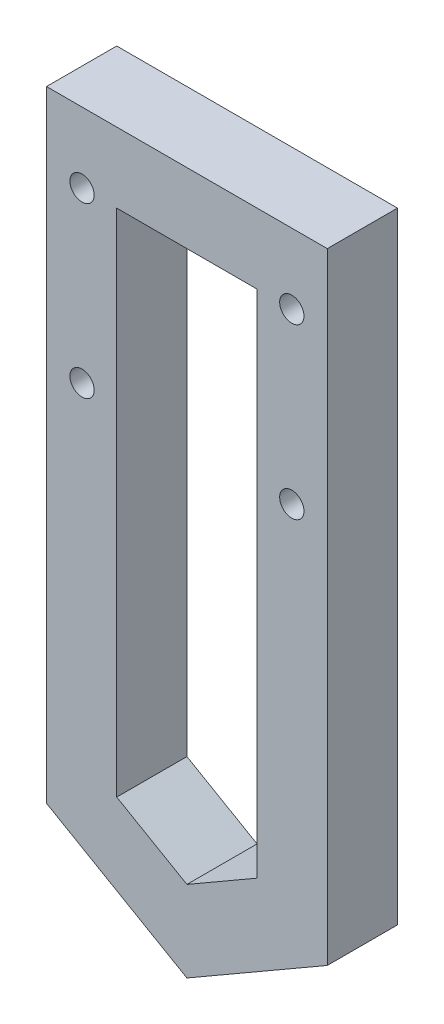
ISO-10303-21;
HEADER;
FILE_DESCRIPTION(('STEP AP214'),'2;1');
FILE_NAME('part.step','',(''),(''),'','','');
FILE_SCHEMA(('AUTOMOTIVE_DESIGN { 1 0 10303 214 1 1 1 1 }'));
ENDSEC;
DATA;
#1=APPLICATION_CONTEXT('core data for automotive mechanical design processes');
#2=APPLICATION_PROTOCOL_DEFINITION('international standard','automotive_design',2000,#1);
#3=PRODUCT_CONTEXT('',#1,'mechanical');
#4=PRODUCT('Part','Part','',(#3));
#5=PRODUCT_RELATED_PRODUCT_CATEGORY('part','',(#4));
#6=PRODUCT_DEFINITION_FORMATION('','',#4);
#7=PRODUCT_DEFINITION_CONTEXT('part definition',#1,'design');
#8=PRODUCT_DEFINITION('design','',#6,#7);
#9=PRODUCT_DEFINITION_SHAPE('','',#8);
#10=(LENGTH_UNIT() NAMED_UNIT(*) SI_UNIT(.MILLI.,.METRE.));
#11=(NAMED_UNIT(*) PLANE_ANGLE_UNIT() SI_UNIT($,.RADIAN.));
#12=(NAMED_UNIT(*) SI_UNIT($,.STERADIAN.) SOLID_ANGLE_UNIT());
#13=UNCERTAINTY_MEASURE_WITH_UNIT(LENGTH_MEASURE(1.E-05),#10,'distance_accuracy_value','');
#14=(GEOMETRIC_REPRESENTATION_CONTEXT(3) GLOBAL_UNCERTAINTY_ASSIGNED_CONTEXT((#13)) GLOBAL_UNIT_ASSIGNED_CONTEXT((#10,
#11,#12)) REPRESENTATION_CONTEXT('',''));
#15=CARTESIAN_POINT('',(0.,0.,0.));
#16=DIRECTION('',(0.,0.,1.));
#17=DIRECTION('',(1.,0.,0.));
#18=AXIS2_PLACEMENT_3D('',#15,#16,#17);
#19=CARTESIAN_POINT('',(0.,0.,10.));
#20=DIRECTION('',(0.,0.,1.));
#21=DIRECTION('',(1.,0.,0.));
#22=AXIS2_PLACEMENT_3D('',#19,#20,#21);
#23=PLANE('',#22);
#24=CARTESIAN_POINT('',(-17.8523682514523,228.318722846225,10.));
#25=DIRECTION('',(0.,0.,1.));
#26=DIRECTION('',(1.,0.,0.));
#27=AXIS2_PLACEMENT_3D('',#24,#25,#26);
#28=CIRCLE('',#27,1.73);
#29=CARTESIAN_POINT('',(-16.1223682514523,228.318722846225,10.));
#30=VERTEX_POINT('',#29);
#31=EDGE_CURVE('E285',#30,#30,#28,.F.);
#32=ORIENTED_EDGE('',*,*,#31,.T.);
#33=EDGE_LOOP('',(#32));
#34=FACE_BOUND('',#33,.T.);
#35=CARTESIAN_POINT('',(-17.8523682514523,204.258722846225,10.));
#36=DIRECTION('',(0.,0.,1.));
#37=DIRECTION('',(1.,0.,0.));
#38=AXIS2_PLACEMENT_3D('',#35,#36,#37);
#39=CIRCLE('',#38,1.73);
#40=CARTESIAN_POINT('',(-16.1223682514523,204.258722846225,10.));
#41=VERTEX_POINT('',#40);
#42=EDGE_CURVE('E281',#41,#41,#39,.F.);
#43=ORIENTED_EDGE('',*,*,#42,.T.);
#44=EDGE_LOOP('',(#43));
#45=FACE_BOUND('',#44,.T.);
#46=DIRECTION('',(0.866025403784439,-0.5,0.));
#47=VECTOR('',#46,1.);
#48=CARTESIAN_POINT('',(51.6944218390617,89.537365093153,10.));
#49=LINE('',#48,#47);
#50=CARTESIAN_POINT('',(-52.7973682514523,149.865728230017,10.));
#51=VERTEX_POINT('',#50);
#52=CARTESIAN_POINT('',(-32.7973682514523,138.318722846225,10.));
#53=VERTEX_POINT('',#52);
#54=EDGE_CURVE('E107',#51,#53,#49,.T.);
#55=ORIENTED_EDGE('',*,*,#54,.T.);
#56=DIRECTION('',(-0.866025403784439,-0.499999999999999,0.));
#57=VECTOR('',#56,1.);
#58=CARTESIAN_POINT('',(-68.0931059647878,117.940719176184,10.));
#59=LINE('',#58,#57);
#60=CARTESIAN_POINT('',(-12.7973682514524,149.865728230017,10.));
#61=VERTEX_POINT('',#60);
#62=EDGE_CURVE('E199',#61,#53,#59,.T.);
#63=ORIENTED_EDGE('',*,*,#62,.F.);
#64=DIRECTION('',(0.,1.,0.));
#65=VECTOR('',#64,1.);
#66=CARTESIAN_POINT('',(-12.7973682514524,0.,10.));
#67=LINE('',#66,#65);
#68=CARTESIAN_POINT('',(-12.7973682514524,238.318722846225,10.));
#69=VERTEX_POINT('',#68);
#70=EDGE_CURVE('E210',#61,#69,#67,.T.);
#71=ORIENTED_EDGE('',*,*,#70,.T.);
#72=DIRECTION('',(1.,0.,0.));
#73=VECTOR('',#72,1.);
#74=CARTESIAN_POINT('',(0.,238.318722846225,10.));
#75=LINE('',#74,#73);
#76=CARTESIAN_POINT('',(-52.7973682514523,238.318722846225,10.));
#77=VERTEX_POINT('',#76);
#78=EDGE_CURVE('E213',#77,#69,#75,.T.);
#79=ORIENTED_EDGE('',*,*,#78,.F.);
#80=DIRECTION('',(0.,1.,0.));
#81=VECTOR('',#80,1.);
#82=CARTESIAN_POINT('',(-52.7973682514523,0.,10.));
#83=LINE('',#82,#81);
#84=EDGE_CURVE('E216',#51,#77,#83,.T.);
#85=ORIENTED_EDGE('',*,*,#84,.F.);
#86=EDGE_LOOP('',(#55,#63,#71,#79,#85));
#87=FACE_BOUND('',#86,.T.);
#88=DIRECTION('',(-1.,0.,0.));
#89=VECTOR('',#88,1.);
#90=CARTESIAN_POINT('',(0.,228.318722846225,10.));
#91=LINE('',#90,#89);
#92=CARTESIAN_POINT('',(-22.7973682514524,228.318722846225,10.));
#93=VERTEX_POINT('',#92);
#94=CARTESIAN_POINT('',(-42.7973682514523,228.318722846225,10.));
#95=VERTEX_POINT('',#94);
#96=EDGE_CURVE('E218',#93,#95,#91,.T.);
#97=ORIENTED_EDGE('',*,*,#96,.F.);
#98=DIRECTION('',(0.,1.,0.));
#99=VECTOR('',#98,1.);
#100=CARTESIAN_POINT('',(-22.7973682514524,0.,10.));
#101=LINE('',#100,#99);
#102=CARTESIAN_POINT('',(-22.7973682514524,155.639230921913,10.));
#103=VERTEX_POINT('',#102);
#104=EDGE_CURVE('E148',#103,#93,#101,.T.);
#105=ORIENTED_EDGE('',*,*,#104,.F.);
#106=DIRECTION('',(0.866025403784438,0.500000000000002,0.));
#107=VECTOR('',#106,1.);
#108=CARTESIAN_POINT('',(-73.0931059647881,126.600973214028,10.));
#109=LINE('',#108,#107);
#110=CARTESIAN_POINT('',(-32.7973682514523,149.865728230017,10.));
#111=VERTEX_POINT('',#110);
#112=EDGE_CURVE('E133',#111,#103,#109,.T.);
#113=ORIENTED_EDGE('',*,*,#112,.F.);
#114=DIRECTION('',(0.866025403784442,-0.499999999999995,0.));
#115=VECTOR('',#114,1.);
#116=CARTESIAN_POINT('',(56.6944218390614,98.1976191309982,10.));
#117=LINE('',#116,#115);
#118=CARTESIAN_POINT('',(-42.7973682514523,155.639230921913,10.));
#119=VERTEX_POINT('',#118);
#120=EDGE_CURVE('E146',#119,#111,#117,.T.);
#121=ORIENTED_EDGE('',*,*,#120,.F.);
#122=DIRECTION('',(0.,-1.,0.));
#123=VECTOR('',#122,1.);
#124=CARTESIAN_POINT('',(-42.7973682514523,0.,10.));
#125=LINE('',#124,#123);
#126=EDGE_CURVE('E151',#95,#119,#125,.T.);
#127=ORIENTED_EDGE('',*,*,#126,.F.);
#128=EDGE_LOOP('',(#97,#105,#113,#121,#127));
#129=FACE_BOUND('',#128,.T.);
#130=CARTESIAN_POINT('',(-47.7423682514523,228.318722846225,10.));
#131=DIRECTION('',(0.,0.,1.));
#132=DIRECTION('',(1.,0.,0.));
#133=AXIS2_PLACEMENT_3D('',#130,#131,#132);
#134=CIRCLE('',#133,1.73);
#135=CARTESIAN_POINT('',(-46.0123682514523,228.318722846225,10.));
#136=VERTEX_POINT('',#135);
#137=EDGE_CURVE('E270',#136,#136,#134,.T.);
#138=ORIENTED_EDGE('',*,*,#137,.F.);
#139=EDGE_LOOP('',(#138));
#140=FACE_BOUND('',#139,.T.);
#141=CARTESIAN_POINT('',(-47.7423682514523,204.258722846225,10.));
#142=DIRECTION('',(0.,0.,1.));
#143=DIRECTION('',(1.,0.,0.));
#144=AXIS2_PLACEMENT_3D('',#141,#142,#143);
#145=CIRCLE('',#144,1.73);
#146=CARTESIAN_POINT('',(-46.0123682514523,204.258722846225,10.));
#147=VERTEX_POINT('',#146);
#148=EDGE_CURVE('E278',#147,#147,#145,.T.);
#149=ORIENTED_EDGE('',*,*,#148,.F.);
#150=EDGE_LOOP('',(#149));
#151=FACE_BOUND('',#150,.T.);
#152=ADVANCED_FACE('F44',(#34,#45,#87,#129,#140,#151),#23,.T.);
#153=CARTESIAN_POINT('',(0.,0.,0.));
#154=DIRECTION('',(0.,0.,1.));
#155=DIRECTION('',(1.,0.,0.));
#156=AXIS2_PLACEMENT_3D('',#153,#154,#155);
#157=PLANE('',#156);
#158=CARTESIAN_POINT('',(-47.7423682514523,228.318722846225,0.));
#159=DIRECTION('',(0.,0.,1.));
#160=DIRECTION('',(1.,0.,0.));
#161=AXIS2_PLACEMENT_3D('',#158,#159,#160);
#162=CIRCLE('',#161,1.73);
#163=CARTESIAN_POINT('',(-46.0123682514523,228.318722846225,0.));
#164=VERTEX_POINT('',#163);
#165=EDGE_CURVE('E273',#164,#164,#162,.T.);
#166=ORIENTED_EDGE('',*,*,#165,.T.);
#167=EDGE_LOOP('',(#166));
#168=FACE_BOUND('',#167,.T.);
#169=CARTESIAN_POINT('',(-17.8523682514523,204.258722846225,0.));
#170=DIRECTION('',(0.,0.,1.));
#171=DIRECTION('',(1.,0.,0.));
#172=AXIS2_PLACEMENT_3D('',#169,#170,#171);
#173=CIRCLE('',#172,1.73);
#174=CARTESIAN_POINT('',(-16.1223682514523,204.258722846225,0.));
#175=VERTEX_POINT('',#174);
#176=EDGE_CURVE('E161',#175,#175,#173,.F.);
#177=ORIENTED_EDGE('',*,*,#176,.F.);
#178=EDGE_LOOP('',(#177));
#179=FACE_BOUND('',#178,.T.);
#180=DIRECTION('',(0.866025403784439,-0.5,0.));
#181=VECTOR('',#180,1.);
#182=CARTESIAN_POINT('',(51.6944218390617,89.537365093153,0.));
#183=LINE('',#182,#181);
#184=CARTESIAN_POINT('',(-52.7973682514523,149.865728230017,0.));
#185=VERTEX_POINT('',#184);
#186=CARTESIAN_POINT('',(-32.7973682514523,138.318722846225,0.));
#187=VERTEX_POINT('',#186);
#188=EDGE_CURVE('E157',#185,#187,#183,.T.);
#189=ORIENTED_EDGE('',*,*,#188,.F.);
#190=DIRECTION('',(0.,1.,0.));
#191=VECTOR('',#190,1.);
#192=CARTESIAN_POINT('',(-52.7973682514523,0.,0.));
#193=LINE('',#192,#191);
#194=CARTESIAN_POINT('',(-52.7973682514523,238.318722846225,0.));
#195=VERTEX_POINT('',#194);
#196=EDGE_CURVE('E170',#185,#195,#193,.T.);
#197=ORIENTED_EDGE('',*,*,#196,.T.);
#198=DIRECTION('',(1.,0.,0.));
#199=VECTOR('',#198,1.);
#200=CARTESIAN_POINT('',(0.,238.318722846225,0.));
#201=LINE('',#200,#199);
#202=CARTESIAN_POINT('',(-12.7973682514524,238.318722846225,0.));
#203=VERTEX_POINT('',#202);
#204=EDGE_CURVE('E167',#195,#203,#201,.T.);
#205=ORIENTED_EDGE('',*,*,#204,.T.);
#206=DIRECTION('',(0.,1.,0.));
#207=VECTOR('',#206,1.);
#208=CARTESIAN_POINT('',(-12.7973682514524,0.,0.));
#209=LINE('',#208,#207);
#210=CARTESIAN_POINT('',(-12.7973682514524,149.865728230017,0.));
#211=VERTEX_POINT('',#210);
#212=EDGE_CURVE('E164',#211,#203,#209,.T.);
#213=ORIENTED_EDGE('',*,*,#212,.F.);
#214=DIRECTION('',(-0.866025403784439,-0.499999999999999,0.));
#215=VECTOR('',#214,1.);
#216=CARTESIAN_POINT('',(-68.0931059647878,117.940719176184,0.));
#217=LINE('',#216,#215);
#218=EDGE_CURVE('E160',#211,#187,#217,.T.);
#219=ORIENTED_EDGE('',*,*,#218,.T.);
#220=EDGE_LOOP('',(#189,#197,#205,#213,#219));
#221=FACE_BOUND('',#220,.T.);
#222=DIRECTION('',(-1.,0.,0.));
#223=VECTOR('',#222,1.);
#224=CARTESIAN_POINT('',(0.,228.318722846225,0.));
#225=LINE('',#224,#223);
#226=CARTESIAN_POINT('',(-22.7973682514524,228.318722846225,0.));
#227=VERTEX_POINT('',#226);
#228=CARTESIAN_POINT('',(-42.7973682514523,228.318722846225,0.));
#229=VERTEX_POINT('',#228);
#230=EDGE_CURVE('E173',#227,#229,#225,.T.);
#231=ORIENTED_EDGE('',*,*,#230,.T.);
#232=DIRECTION('',(0.,-1.,0.));
#233=VECTOR('',#232,1.);
#234=CARTESIAN_POINT('',(-42.7973682514523,0.,0.));
#235=LINE('',#234,#233);
#236=CARTESIAN_POINT('',(-42.7973682514523,155.639230921913,0.));
#237=VERTEX_POINT('',#236);
#238=EDGE_CURVE('E181',#229,#237,#235,.T.);
#239=ORIENTED_EDGE('',*,*,#238,.T.);
#240=DIRECTION('',(0.866025403784442,-0.499999999999995,0.));
#241=VECTOR('',#240,1.);
#242=CARTESIAN_POINT('',(56.6944218390614,98.1976191309982,0.));
#243=LINE('',#242,#241);
#244=CARTESIAN_POINT('',(-32.7973682514523,149.865728230017,0.));
#245=VERTEX_POINT('',#244);
#246=EDGE_CURVE('E179',#237,#245,#243,.T.);
#247=ORIENTED_EDGE('',*,*,#246,.T.);
#248=DIRECTION('',(0.866025403784438,0.500000000000002,0.));
#249=VECTOR('',#248,1.);
#250=CARTESIAN_POINT('',(-73.0931059647881,126.600973214028,0.));
#251=LINE('',#250,#249);
#252=CARTESIAN_POINT('',(-22.7973682514524,155.639230921913,0.));
#253=VERTEX_POINT('',#252);
#254=EDGE_CURVE('E135',#245,#253,#251,.T.);
#255=ORIENTED_EDGE('',*,*,#254,.T.);
#256=DIRECTION('',(0.,1.,0.));
#257=VECTOR('',#256,1.);
#258=CARTESIAN_POINT('',(-22.7973682514524,0.,0.));
#259=LINE('',#258,#257);
#260=EDGE_CURVE('E175',#253,#227,#259,.T.);
#261=ORIENTED_EDGE('',*,*,#260,.T.);
#262=EDGE_LOOP('',(#231,#239,#247,#255,#261));
#263=FACE_BOUND('',#262,.T.);
#264=CARTESIAN_POINT('',(-17.8523682514523,228.318722846225,0.));
#265=DIRECTION('',(0.,0.,1.));
#266=DIRECTION('',(1.,0.,0.));
#267=AXIS2_PLACEMENT_3D('',#264,#265,#266);
#268=CIRCLE('',#267,1.73);
#269=CARTESIAN_POINT('',(-16.1223682514523,228.318722846225,0.));
#270=VERTEX_POINT('',#269);
#271=EDGE_CURVE('E275',#270,#270,#268,.F.);
#272=ORIENTED_EDGE('',*,*,#271,.F.);
#273=EDGE_LOOP('',(#272));
#274=FACE_BOUND('',#273,.T.);
#275=CARTESIAN_POINT('',(-47.7423682514523,204.258722846225,0.));
#276=DIRECTION('',(0.,0.,1.));
#277=DIRECTION('',(1.,0.,0.));
#278=AXIS2_PLACEMENT_3D('',#275,#276,#277);
#279=CIRCLE('',#278,1.73);
#280=CARTESIAN_POINT('',(-46.0123682514523,204.258722846225,0.));
#281=VERTEX_POINT('',#280);
#282=EDGE_CURVE('E282',#281,#281,#279,.T.);
#283=ORIENTED_EDGE('',*,*,#282,.T.);
#284=EDGE_LOOP('',(#283));
#285=FACE_BOUND('',#284,.T.);
#286=ADVANCED_FACE('F204',(#168,#179,#221,#263,#274,#285),#157,.F.);
#287=CARTESIAN_POINT('',(0.,228.318722846225,10.));
#288=DIRECTION('',(0.,-1.,0.));
#289=DIRECTION('',(0.,0.,-1.));
#290=AXIS2_PLACEMENT_3D('',#287,#288,#289);
#291=PLANE('',#290);
#292=ORIENTED_EDGE('',*,*,#230,.F.);
#293=DIRECTION('',(0.,0.,-1.));
#294=VECTOR('',#293,1.);
#295=CARTESIAN_POINT('',(-22.7973682514524,228.318722846225,10.));
#296=LINE('',#295,#294);
#297=EDGE_CURVE('E12',#93,#227,#296,.T.);
#298=ORIENTED_EDGE('',*,*,#297,.F.);
#299=ORIENTED_EDGE('',*,*,#96,.T.);
#300=DIRECTION('',(0.,0.,-1.));
#301=VECTOR('',#300,1.);
#302=CARTESIAN_POINT('',(-42.7973682514523,228.318722846225,10.));
#303=LINE('',#302,#301);
#304=EDGE_CURVE('E63',#95,#229,#303,.T.);
#305=ORIENTED_EDGE('',*,*,#304,.T.);
#306=EDGE_LOOP('',(#292,#298,#299,#305));
#307=FACE_BOUND('',#306,.T.);
#308=ADVANCED_FACE('F250',(#307),#291,.T.);
#309=CARTESIAN_POINT('',(-22.7973682514524,0.,10.));
#310=DIRECTION('',(-1.,0.,0.));
#311=DIRECTION('',(0.,0.,1.));
#312=AXIS2_PLACEMENT_3D('',#309,#310,#311);
#313=PLANE('',#312);
#314=ORIENTED_EDGE('',*,*,#260,.F.);
#315=DIRECTION('',(0.,0.,-1.));
#316=VECTOR('',#315,1.);
#317=CARTESIAN_POINT('',(-22.7973682514524,155.639230921913,10.));
#318=LINE('',#317,#316);
#319=EDGE_CURVE('E54',#103,#253,#318,.T.);
#320=ORIENTED_EDGE('',*,*,#319,.F.);
#321=ORIENTED_EDGE('',*,*,#104,.T.);
#322=ORIENTED_EDGE('',*,*,#297,.T.);
#323=EDGE_LOOP('',(#314,#320,#321,#322));
#324=FACE_BOUND('',#323,.T.);
#325=ADVANCED_FACE('F225',(#324),#313,.T.);
#326=CARTESIAN_POINT('',(-73.0931059647881,126.600973214028,10.));
#327=DIRECTION('',(-0.500000000000002,0.866025403784438,0.));
#328=DIRECTION('',(-0.866025403784438,-0.500000000000002,0.));
#329=AXIS2_PLACEMENT_3D('',#326,#327,#328);
#330=PLANE('',#329);
#331=ORIENTED_EDGE('',*,*,#254,.F.);
#332=DIRECTION('',(0.,0.,-1.));
#333=VECTOR('',#332,1.);
#334=CARTESIAN_POINT('',(-32.7973682514523,149.865728230017,10.));
#335=LINE('',#334,#333);
#336=EDGE_CURVE('E130',#111,#245,#335,.T.);
#337=ORIENTED_EDGE('',*,*,#336,.F.);
#338=ORIENTED_EDGE('',*,*,#112,.T.);
#339=ORIENTED_EDGE('',*,*,#319,.T.);
#340=EDGE_LOOP('',(#331,#337,#338,#339));
#341=FACE_BOUND('',#340,.T.);
#342=ADVANCED_FACE('F132',(#341),#330,.T.);
#343=CARTESIAN_POINT('',(56.6944218390614,98.1976191309982,10.));
#344=DIRECTION('',(0.499999999999995,0.866025403784442,0.));
#345=DIRECTION('',(-0.866025403784442,0.499999999999995,0.));
#346=AXIS2_PLACEMENT_3D('',#343,#344,#345);
#347=PLANE('',#346);
#348=ORIENTED_EDGE('',*,*,#246,.F.);
#349=DIRECTION('',(0.,0.,-1.));
#350=VECTOR('',#349,1.);
#351=CARTESIAN_POINT('',(-42.7973682514523,155.639230921913,10.));
#352=LINE('',#351,#350);
#353=EDGE_CURVE('E94',#119,#237,#352,.T.);
#354=ORIENTED_EDGE('',*,*,#353,.F.);
#355=ORIENTED_EDGE('',*,*,#120,.T.);
#356=ORIENTED_EDGE('',*,*,#336,.T.);
#357=EDGE_LOOP('',(#348,#354,#355,#356));
#358=FACE_BOUND('',#357,.T.);
#359=ADVANCED_FACE('F150',(#358),#347,.T.);
#360=CARTESIAN_POINT('',(51.6944218390617,89.537365093153,10.));
#361=DIRECTION('',(0.5,0.866025403784438,0.));
#362=DIRECTION('',(-0.866025403784438,0.5,0.));
#363=AXIS2_PLACEMENT_3D('',#360,#361,#362);
#364=PLANE('',#363);
#365=ORIENTED_EDGE('',*,*,#188,.T.);
#366=DIRECTION('',(0.,0.,-1.));
#367=VECTOR('',#366,1.);
#368=CARTESIAN_POINT('',(-32.7973682514523,138.318722846225,10.));
#369=LINE('',#368,#367);
#370=EDGE_CURVE('E48',#53,#187,#369,.T.);
#371=ORIENTED_EDGE('',*,*,#370,.F.);
#372=ORIENTED_EDGE('',*,*,#54,.F.);
#373=DIRECTION('',(0.,0.,-1.));
#374=VECTOR('',#373,1.);
#375=CARTESIAN_POINT('',(-52.7973682514523,149.865728230017,10.));
#376=LINE('',#375,#374);
#377=EDGE_CURVE('E153',#51,#185,#376,.T.);
#378=ORIENTED_EDGE('',*,*,#377,.T.);
#379=EDGE_LOOP('',(#365,#371,#372,#378));
#380=FACE_BOUND('',#379,.T.);
#381=ADVANCED_FACE('F46',(#380),#364,.F.);
#382=CARTESIAN_POINT('',(-68.0931059647878,117.940719176184,10.));
#383=DIRECTION('',(0.499999999999999,-0.866025403784439,0.));
#384=DIRECTION('',(0.866025403784439,0.499999999999999,0.));
#385=AXIS2_PLACEMENT_3D('',#382,#383,#384);
#386=PLANE('',#385);
#387=ORIENTED_EDGE('',*,*,#218,.F.);
#388=DIRECTION('',(0.,0.,-1.));
#389=VECTOR('',#388,1.);
#390=CARTESIAN_POINT('',(-12.7973682514524,149.865728230017,10.));
#391=LINE('',#390,#389);
#392=EDGE_CURVE('E191',#61,#211,#391,.T.);
#393=ORIENTED_EDGE('',*,*,#392,.F.);
#394=ORIENTED_EDGE('',*,*,#62,.T.);
#395=ORIENTED_EDGE('',*,*,#370,.T.);
#396=EDGE_LOOP('',(#387,#393,#394,#395));
#397=FACE_BOUND('',#396,.T.);
#398=ADVANCED_FACE('F198',(#397),#386,.T.);
#399=CARTESIAN_POINT('',(-12.7973682514524,0.,10.));
#400=DIRECTION('',(-1.,0.,0.));
#401=DIRECTION('',(0.,-1.,0.));
#402=AXIS2_PLACEMENT_3D('',#399,#400,#401);
#403=PLANE('',#402);
#404=ORIENTED_EDGE('',*,*,#212,.T.);
#405=DIRECTION('',(0.,0.,-1.));
#406=VECTOR('',#405,1.);
#407=CARTESIAN_POINT('',(-12.7973682514524,238.318722846225,10.));
#408=LINE('',#407,#406);
#409=EDGE_CURVE('E190',#69,#203,#408,.T.);
#410=ORIENTED_EDGE('',*,*,#409,.F.);
#411=ORIENTED_EDGE('',*,*,#70,.F.);
#412=ORIENTED_EDGE('',*,*,#392,.T.);
#413=EDGE_LOOP('',(#404,#410,#411,#412));
#414=FACE_BOUND('',#413,.T.);
#415=ADVANCED_FACE('F208',(#414),#403,.F.);
#416=CARTESIAN_POINT('',(0.,238.318722846225,10.));
#417=DIRECTION('',(0.,1.,0.));
#418=DIRECTION('',(-1.,0.,0.));
#419=AXIS2_PLACEMENT_3D('',#416,#417,#418);
#420=PLANE('',#419);
#421=ORIENTED_EDGE('',*,*,#204,.F.);
#422=DIRECTION('',(0.,0.,-1.));
#423=VECTOR('',#422,1.);
#424=CARTESIAN_POINT('',(-52.7973682514523,238.318722846225,10.));
#425=LINE('',#424,#423);
#426=EDGE_CURVE('E188',#77,#195,#425,.T.);
#427=ORIENTED_EDGE('',*,*,#426,.F.);
#428=ORIENTED_EDGE('',*,*,#78,.T.);
#429=ORIENTED_EDGE('',*,*,#409,.T.);
#430=EDGE_LOOP('',(#421,#427,#428,#429));
#431=FACE_BOUND('',#430,.T.);
#432=ADVANCED_FACE('F214',(#431),#420,.T.);
#433=CARTESIAN_POINT('',(-52.7973682514523,0.,10.));
#434=DIRECTION('',(-1.,0.,0.));
#435=DIRECTION('',(0.,-1.,0.));
#436=AXIS2_PLACEMENT_3D('',#433,#434,#435);
#437=PLANE('',#436);
#438=ORIENTED_EDGE('',*,*,#196,.F.);
#439=ORIENTED_EDGE('',*,*,#377,.F.);
#440=ORIENTED_EDGE('',*,*,#84,.T.);
#441=ORIENTED_EDGE('',*,*,#426,.T.);
#442=EDGE_LOOP('',(#438,#439,#440,#441));
#443=FACE_BOUND('',#442,.T.);
#444=ADVANCED_FACE('F230',(#443),#437,.T.);
#445=CARTESIAN_POINT('',(-42.7973682514523,0.,10.));
#446=DIRECTION('',(1.,0.,0.));
#447=DIRECTION('',(0.,0.,-1.));
#448=AXIS2_PLACEMENT_3D('',#445,#446,#447);
#449=PLANE('',#448);
#450=ORIENTED_EDGE('',*,*,#238,.F.);
#451=ORIENTED_EDGE('',*,*,#304,.F.);
#452=ORIENTED_EDGE('',*,*,#126,.T.);
#453=ORIENTED_EDGE('',*,*,#353,.T.);
#454=EDGE_LOOP('',(#450,#451,#452,#453));
#455=FACE_BOUND('',#454,.T.);
#456=ADVANCED_FACE('F227',(#455),#449,.T.);
#457=CARTESIAN_POINT('',(-17.8523682514523,204.258722846225,0.));
#458=DIRECTION('',(0.,0.,1.));
#459=DIRECTION('',(1.,0.,0.));
#460=AXIS2_PLACEMENT_3D('',#457,#458,#459);
#461=CYLINDRICAL_SURFACE('',#460,1.73);
#462=ORIENTED_EDGE('',*,*,#176,.T.);
#463=EDGE_LOOP('',(#462));
#464=FACE_BOUND('',#463,.T.);
#465=ORIENTED_EDGE('',*,*,#42,.F.);
#466=EDGE_LOOP('',(#465));
#467=FACE_BOUND('',#466,.T.);
#468=ADVANCED_FACE('F229',(#464,#467),#461,.F.);
#469=CARTESIAN_POINT('',(-47.7423682514523,228.318722846225,0.));
#470=DIRECTION('',(0.,0.,1.));
#471=DIRECTION('',(1.,0.,0.));
#472=AXIS2_PLACEMENT_3D('',#469,#470,#471);
#473=CYLINDRICAL_SURFACE('',#472,1.73);
#474=ORIENTED_EDGE('',*,*,#137,.T.);
#475=EDGE_LOOP('',(#474));
#476=FACE_BOUND('',#475,.T.);
#477=ORIENTED_EDGE('',*,*,#165,.F.);
#478=EDGE_LOOP('',(#477));
#479=FACE_BOUND('',#478,.T.);
#480=ADVANCED_FACE('F237',(#476,#479),#473,.F.);
#481=CARTESIAN_POINT('',(-17.8523682514523,228.318722846225,0.));
#482=DIRECTION('',(0.,0.,1.));
#483=DIRECTION('',(1.,0.,0.));
#484=AXIS2_PLACEMENT_3D('',#481,#482,#483);
#485=CYLINDRICAL_SURFACE('',#484,1.73);
#486=ORIENTED_EDGE('',*,*,#271,.T.);
#487=EDGE_LOOP('',(#486));
#488=FACE_BOUND('',#487,.T.);
#489=ORIENTED_EDGE('',*,*,#31,.F.);
#490=EDGE_LOOP('',(#489));
#491=FACE_BOUND('',#490,.T.);
#492=ADVANCED_FACE('F255',(#488,#491),#485,.F.);
#493=CARTESIAN_POINT('',(-47.7423682514523,204.258722846225,0.));
#494=DIRECTION('',(0.,0.,1.));
#495=DIRECTION('',(1.,0.,0.));
#496=AXIS2_PLACEMENT_3D('',#493,#494,#495);
#497=CYLINDRICAL_SURFACE('',#496,1.73);
#498=ORIENTED_EDGE('',*,*,#282,.F.);
#499=EDGE_LOOP('',(#498));
#500=FACE_BOUND('',#499,.T.);
#501=ORIENTED_EDGE('',*,*,#148,.T.);
#502=EDGE_LOOP('',(#501));
#503=FACE_BOUND('',#502,.T.);
#504=ADVANCED_FACE('F258',(#500,#503),#497,.F.);
#505=CLOSED_SHELL('',(#152,#286,#308,#325,#342,#359,#381,#398,#415,#432,#444,#456,#468,#480,
#492,#504));
#506=MANIFOLD_SOLID_BREP('B2',#505);
#507=ADVANCED_BREP_SHAPE_REPRESENTATION('',(#18,#506),#14);
#508=SHAPE_DEFINITION_REPRESENTATION(#9,#507);
ENDSEC;
END-ISO-10303-21;
